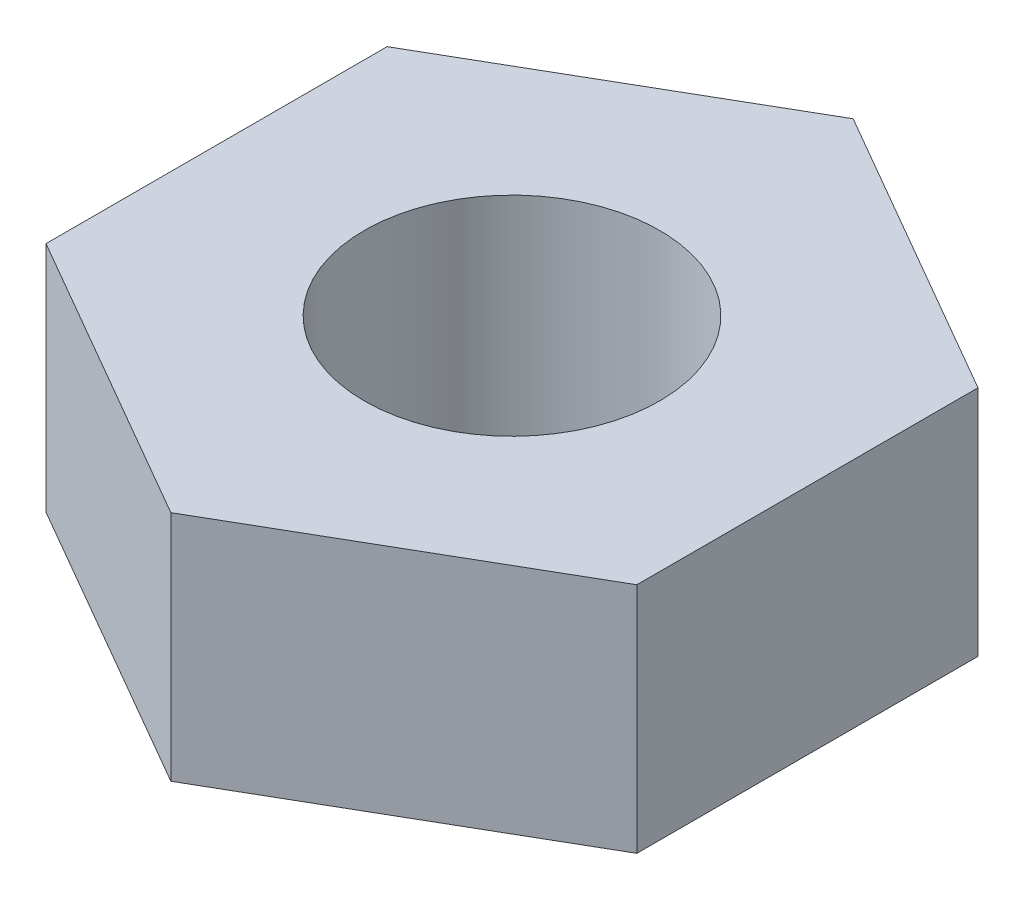
ISO-10303-21;
HEADER;
FILE_DESCRIPTION(('STEP AP214'),'2;1');
FILE_NAME('part.step','',(''),(''),'','','');
FILE_SCHEMA(('AUTOMOTIVE_DESIGN { 1 0 10303 214 1 1 1 1 }'));
ENDSEC;
DATA;
#1=APPLICATION_CONTEXT('core data for automotive mechanical design processes');
#2=APPLICATION_PROTOCOL_DEFINITION('international standard','automotive_design',2000,#1);
#3=PRODUCT_CONTEXT('',#1,'mechanical');
#4=PRODUCT('Part','Part','',(#3));
#5=PRODUCT_RELATED_PRODUCT_CATEGORY('part','',(#4));
#6=PRODUCT_DEFINITION_FORMATION('','',#4);
#7=PRODUCT_DEFINITION_CONTEXT('part definition',#1,'design');
#8=PRODUCT_DEFINITION('design','',#6,#7);
#9=PRODUCT_DEFINITION_SHAPE('','',#8);
#10=(LENGTH_UNIT() NAMED_UNIT(*) SI_UNIT(.MILLI.,.METRE.));
#11=(NAMED_UNIT(*) PLANE_ANGLE_UNIT() SI_UNIT($,.RADIAN.));
#12=(NAMED_UNIT(*) SI_UNIT($,.STERADIAN.) SOLID_ANGLE_UNIT());
#13=UNCERTAINTY_MEASURE_WITH_UNIT(LENGTH_MEASURE(1.E-05),#10,'distance_accuracy_value','');
#14=(GEOMETRIC_REPRESENTATION_CONTEXT(3) GLOBAL_UNCERTAINTY_ASSIGNED_CONTEXT((#13)) GLOBAL_UNIT_ASSIGNED_CONTEXT((#10,
#11,#12)) REPRESENTATION_CONTEXT('',''));
#15=CARTESIAN_POINT('',(0.,0.,0.));
#16=DIRECTION('',(0.,0.,1.));
#17=DIRECTION('',(1.,0.,0.));
#18=AXIS2_PLACEMENT_3D('',#15,#16,#17);
#19=CARTESIAN_POINT('',(12.7,5.,7.33234841870825));
#20=DIRECTION('',(-1.,0.,0.));
#21=DIRECTION('',(0.,0.,1.));
#22=AXIS2_PLACEMENT_3D('',#19,#20,#21);
#23=PLANE('',#22);
#24=DIRECTION('',(0.,0.,-1.));
#25=VECTOR('',#24,1.);
#26=CARTESIAN_POINT('',(12.7,-5.,7.33234841870825));
#27=LINE('',#26,#25);
#28=CARTESIAN_POINT('',(12.7,-5.,7.33234841870825));
#29=VERTEX_POINT('',#28);
#30=CARTESIAN_POINT('',(12.7,-5.,-7.33234841870826));
#31=VERTEX_POINT('',#30);
#32=EDGE_CURVE('E121',#29,#31,#27,.T.);
#33=ORIENTED_EDGE('',*,*,#32,.T.);
#34=DIRECTION('',(0.,-1.,0.));
#35=VECTOR('',#34,1.);
#36=CARTESIAN_POINT('',(12.7,5.,-7.33234841870826));
#37=LINE('',#36,#35);
#38=CARTESIAN_POINT('',(12.7,5.,-7.33234841870826));
#39=VERTEX_POINT('',#38);
#40=EDGE_CURVE('E11',#39,#31,#37,.T.);
#41=ORIENTED_EDGE('',*,*,#40,.F.);
#42=DIRECTION('',(0.,0.,-1.));
#43=VECTOR('',#42,1.);
#44=CARTESIAN_POINT('',(12.7,5.,7.33234841870825));
#45=LINE('',#44,#43);
#46=CARTESIAN_POINT('',(12.7,5.,7.33234841870825));
#47=VERTEX_POINT('',#46);
#48=EDGE_CURVE('E132',#47,#39,#45,.T.);
#49=ORIENTED_EDGE('',*,*,#48,.F.);
#50=DIRECTION('',(0.,-1.,0.));
#51=VECTOR('',#50,1.);
#52=CARTESIAN_POINT('',(12.7,5.,7.33234841870825));
#53=LINE('',#52,#51);
#54=EDGE_CURVE('E117',#47,#29,#53,.T.);
#55=ORIENTED_EDGE('',*,*,#54,.T.);
#56=EDGE_LOOP('',(#33,#41,#49,#55));
#57=FACE_BOUND('',#56,.T.);
#58=ADVANCED_FACE('F37',(#57),#23,.F.);
#59=CARTESIAN_POINT('',(12.7,5.,-7.33234841870826));
#60=DIRECTION('',(-0.5,0.,0.866025403784439));
#61=DIRECTION('',(0.866025403784439,0.,0.5));
#62=AXIS2_PLACEMENT_3D('',#59,#60,#61);
#63=PLANE('',#62);
#64=DIRECTION('',(-0.866025403784438,0.,-0.5));
#65=VECTOR('',#64,1.);
#66=CARTESIAN_POINT('',(12.7,-5.,-7.33234841870826));
#67=LINE('',#66,#65);
#68=CARTESIAN_POINT('',(0.,-5.,-14.6646968374165));
#69=VERTEX_POINT('',#68);
#70=EDGE_CURVE('E124',#31,#69,#67,.T.);
#71=ORIENTED_EDGE('',*,*,#70,.T.);
#72=DIRECTION('',(0.,-1.,0.));
#73=VECTOR('',#72,1.);
#74=CARTESIAN_POINT('',(0.,5.,-14.6646968374165));
#75=LINE('',#74,#73);
#76=CARTESIAN_POINT('',(0.,5.,-14.6646968374165));
#77=VERTEX_POINT('',#76);
#78=EDGE_CURVE('E45',#77,#69,#75,.T.);
#79=ORIENTED_EDGE('',*,*,#78,.F.);
#80=DIRECTION('',(-0.866025403784438,0.,-0.5));
#81=VECTOR('',#80,1.);
#82=CARTESIAN_POINT('',(12.7,5.,-7.33234841870826));
#83=LINE('',#82,#81);
#84=EDGE_CURVE('E90',#39,#77,#83,.T.);
#85=ORIENTED_EDGE('',*,*,#84,.F.);
#86=ORIENTED_EDGE('',*,*,#40,.T.);
#87=EDGE_LOOP('',(#71,#79,#85,#86));
#88=FACE_BOUND('',#87,.T.);
#89=ADVANCED_FACE('F157',(#88),#63,.F.);
#90=CARTESIAN_POINT('',(0.,5.,-14.6646968374165));
#91=DIRECTION('',(0.5,0.,0.866025403784438));
#92=DIRECTION('',(0.866025403784438,0.,-0.5));
#93=AXIS2_PLACEMENT_3D('',#90,#91,#92);
#94=PLANE('',#93);
#95=DIRECTION('',(-0.866025403784438,0.,0.5));
#96=VECTOR('',#95,1.);
#97=CARTESIAN_POINT('',(0.,-5.,-14.6646968374165));
#98=LINE('',#97,#96);
#99=CARTESIAN_POINT('',(-12.7,-5.,-7.33234841870824));
#100=VERTEX_POINT('',#99);
#101=EDGE_CURVE('E127',#69,#100,#98,.T.);
#102=ORIENTED_EDGE('',*,*,#101,.T.);
#103=DIRECTION('',(0.,-1.,0.));
#104=VECTOR('',#103,1.);
#105=CARTESIAN_POINT('',(-12.7,5.,-7.33234841870824));
#106=LINE('',#105,#104);
#107=CARTESIAN_POINT('',(-12.7,5.,-7.33234841870824));
#108=VERTEX_POINT('',#107);
#109=EDGE_CURVE('E112',#108,#100,#106,.T.);
#110=ORIENTED_EDGE('',*,*,#109,.F.);
#111=DIRECTION('',(-0.866025403784438,0.,0.5));
#112=VECTOR('',#111,1.);
#113=CARTESIAN_POINT('',(0.,5.,-14.6646968374165));
#114=LINE('',#113,#112);
#115=EDGE_CURVE('E103',#77,#108,#114,.T.);
#116=ORIENTED_EDGE('',*,*,#115,.F.);
#117=ORIENTED_EDGE('',*,*,#78,.T.);
#118=EDGE_LOOP('',(#102,#110,#116,#117));
#119=FACE_BOUND('',#118,.T.);
#120=ADVANCED_FACE('F138',(#119),#94,.F.);
#121=CARTESIAN_POINT('',(-12.7,5.,-7.33234841870824));
#122=DIRECTION('',(1.,0.,0.));
#123=DIRECTION('',(0.,0.,-1.));
#124=AXIS2_PLACEMENT_3D('',#121,#122,#123);
#125=PLANE('',#124);
#126=DIRECTION('',(0.,0.,1.));
#127=VECTOR('',#126,1.);
#128=CARTESIAN_POINT('',(-12.7,-5.,-7.33234841870824));
#129=LINE('',#128,#127);
#130=CARTESIAN_POINT('',(-12.7,-5.,7.33234841870825));
#131=VERTEX_POINT('',#130);
#132=EDGE_CURVE('E111',#100,#131,#129,.T.);
#133=ORIENTED_EDGE('',*,*,#132,.T.);
#134=DIRECTION('',(0.,-1.,0.));
#135=VECTOR('',#134,1.);
#136=CARTESIAN_POINT('',(-12.7,5.,7.33234841870825));
#137=LINE('',#136,#135);
#138=CARTESIAN_POINT('',(-12.7,5.,7.33234841870825));
#139=VERTEX_POINT('',#138);
#140=EDGE_CURVE('E108',#139,#131,#137,.T.);
#141=ORIENTED_EDGE('',*,*,#140,.F.);
#142=DIRECTION('',(0.,0.,1.));
#143=VECTOR('',#142,1.);
#144=CARTESIAN_POINT('',(-12.7,5.,-7.33234841870824));
#145=LINE('',#144,#143);
#146=EDGE_CURVE('E97',#108,#139,#145,.T.);
#147=ORIENTED_EDGE('',*,*,#146,.F.);
#148=ORIENTED_EDGE('',*,*,#109,.T.);
#149=EDGE_LOOP('',(#133,#141,#147,#148));
#150=FACE_BOUND('',#149,.T.);
#151=ADVANCED_FACE('F109',(#150),#125,.F.);
#152=CARTESIAN_POINT('',(-12.7,5.,7.33234841870825));
#153=DIRECTION('',(0.5,0.,-0.866025403784439));
#154=DIRECTION('',(-0.866025403784439,0.,-0.5));
#155=AXIS2_PLACEMENT_3D('',#152,#153,#154);
#156=PLANE('',#155);
#157=DIRECTION('',(0.866025403784438,0.,0.5));
#158=VECTOR('',#157,1.);
#159=CARTESIAN_POINT('',(-12.7,-5.,7.33234841870825));
#160=LINE('',#159,#158);
#161=CARTESIAN_POINT('',(0.,-5.,14.6646968374165));
#162=VERTEX_POINT('',#161);
#163=EDGE_CURVE('E76',#131,#162,#160,.T.);
#164=ORIENTED_EDGE('',*,*,#163,.T.);
#165=DIRECTION('',(0.,-1.,0.));
#166=VECTOR('',#165,1.);
#167=CARTESIAN_POINT('',(0.,5.,14.6646968374165));
#168=LINE('',#167,#166);
#169=CARTESIAN_POINT('',(0.,5.,14.6646968374165));
#170=VERTEX_POINT('',#169);
#171=EDGE_CURVE('E113',#170,#162,#168,.T.);
#172=ORIENTED_EDGE('',*,*,#171,.F.);
#173=DIRECTION('',(0.866025403784438,0.,0.5));
#174=VECTOR('',#173,1.);
#175=CARTESIAN_POINT('',(-12.7,5.,7.33234841870825));
#176=LINE('',#175,#174);
#177=EDGE_CURVE('E101',#139,#170,#176,.T.);
#178=ORIENTED_EDGE('',*,*,#177,.F.);
#179=ORIENTED_EDGE('',*,*,#140,.T.);
#180=EDGE_LOOP('',(#164,#172,#178,#179));
#181=FACE_BOUND('',#180,.T.);
#182=ADVANCED_FACE('F115',(#181),#156,.F.);
#183=CARTESIAN_POINT('',(0.,5.,14.6646968374165));
#184=DIRECTION('',(-0.5,0.,-0.866025403784438));
#185=DIRECTION('',(-0.866025403784439,0.,0.5));
#186=AXIS2_PLACEMENT_3D('',#183,#184,#185);
#187=PLANE('',#186);
#188=DIRECTION('',(0.866025403784439,0.,-0.5));
#189=VECTOR('',#188,1.);
#190=CARTESIAN_POINT('',(0.,-5.,14.6646968374165));
#191=LINE('',#190,#189);
#192=EDGE_CURVE('E82',#162,#29,#191,.T.);
#193=ORIENTED_EDGE('',*,*,#192,.T.);
#194=ORIENTED_EDGE('',*,*,#54,.F.);
#195=DIRECTION('',(0.866025403784439,0.,-0.5));
#196=VECTOR('',#195,1.);
#197=CARTESIAN_POINT('',(0.,5.,14.6646968374165));
#198=LINE('',#197,#196);
#199=EDGE_CURVE('E53',#170,#47,#198,.T.);
#200=ORIENTED_EDGE('',*,*,#199,.F.);
#201=ORIENTED_EDGE('',*,*,#171,.T.);
#202=EDGE_LOOP('',(#193,#194,#200,#201));
#203=FACE_BOUND('',#202,.T.);
#204=ADVANCED_FACE('F145',(#203),#187,.F.);
#205=CARTESIAN_POINT('',(0.,5.,0.));
#206=DIRECTION('',(0.,1.,0.));
#207=DIRECTION('',(0.,0.,1.));
#208=AXIS2_PLACEMENT_3D('',#205,#206,#207);
#209=PLANE('',#208);
#210=CARTESIAN_POINT('',(0.,5.,0.));
#211=DIRECTION('',(0.,1.,0.));
#212=DIRECTION('',(0.,0.,1.));
#213=AXIS2_PLACEMENT_3D('',#210,#211,#212);
#214=CIRCLE('',#213,6.35);
#215=CARTESIAN_POINT('',(0.,5.,6.35));
#216=VERTEX_POINT('',#215);
#217=EDGE_CURVE('E220',#216,#216,#214,.T.);
#218=ORIENTED_EDGE('',*,*,#217,.F.);
#219=EDGE_LOOP('',(#218));
#220=FACE_BOUND('',#219,.T.);
#221=ORIENTED_EDGE('',*,*,#48,.T.);
#222=ORIENTED_EDGE('',*,*,#84,.T.);
#223=ORIENTED_EDGE('',*,*,#115,.T.);
#224=ORIENTED_EDGE('',*,*,#146,.T.);
#225=ORIENTED_EDGE('',*,*,#177,.T.);
#226=ORIENTED_EDGE('',*,*,#199,.T.);
#227=EDGE_LOOP('',(#221,#222,#223,#224,#225,#226));
#228=FACE_BOUND('',#227,.T.);
#229=ADVANCED_FACE('F99',(#220,#228),#209,.T.);
#230=CARTESIAN_POINT('',(0.,-5.,0.));
#231=DIRECTION('',(0.,1.,0.));
#232=DIRECTION('',(0.,0.,1.));
#233=AXIS2_PLACEMENT_3D('',#230,#231,#232);
#234=PLANE('',#233);
#235=CARTESIAN_POINT('',(0.,-5.,0.));
#236=DIRECTION('',(0.,1.,0.));
#237=DIRECTION('',(0.,0.,1.));
#238=AXIS2_PLACEMENT_3D('',#235,#236,#237);
#239=CIRCLE('',#238,6.35);
#240=CARTESIAN_POINT('',(0.,-5.,6.35));
#241=VERTEX_POINT('',#240);
#242=EDGE_CURVE('E125',#241,#241,#239,.T.);
#243=ORIENTED_EDGE('',*,*,#242,.T.);
#244=EDGE_LOOP('',(#243));
#245=FACE_BOUND('',#244,.T.);
#246=ORIENTED_EDGE('',*,*,#32,.F.);
#247=ORIENTED_EDGE('',*,*,#192,.F.);
#248=ORIENTED_EDGE('',*,*,#163,.F.);
#249=ORIENTED_EDGE('',*,*,#132,.F.);
#250=ORIENTED_EDGE('',*,*,#101,.F.);
#251=ORIENTED_EDGE('',*,*,#70,.F.);
#252=EDGE_LOOP('',(#246,#247,#248,#249,#250,#251));
#253=FACE_BOUND('',#252,.T.);
#254=ADVANCED_FACE('F141',(#245,#253),#234,.F.);
#255=CARTESIAN_POINT('',(0.,-5.,0.));
#256=DIRECTION('',(0.,1.,0.));
#257=DIRECTION('',(0.,0.,1.));
#258=AXIS2_PLACEMENT_3D('',#255,#256,#257);
#259=CYLINDRICAL_SURFACE('',#258,6.35);
#260=ORIENTED_EDGE('',*,*,#242,.F.);
#261=EDGE_LOOP('',(#260));
#262=FACE_BOUND('',#261,.T.);
#263=ORIENTED_EDGE('',*,*,#217,.T.);
#264=EDGE_LOOP('',(#263));
#265=FACE_BOUND('',#264,.T.);
#266=ADVANCED_FACE('F195',(#262,#265),#259,.F.);
#267=CLOSED_SHELL('',(#58,#89,#120,#151,#182,#204,#229,#254,#266));
#268=MANIFOLD_SOLID_BREP('B2',#267);
#269=ADVANCED_BREP_SHAPE_REPRESENTATION('',(#18,#268),#14);
#270=SHAPE_DEFINITION_REPRESENTATION(#9,#269);
ENDSEC;
END-ISO-10303-21;
